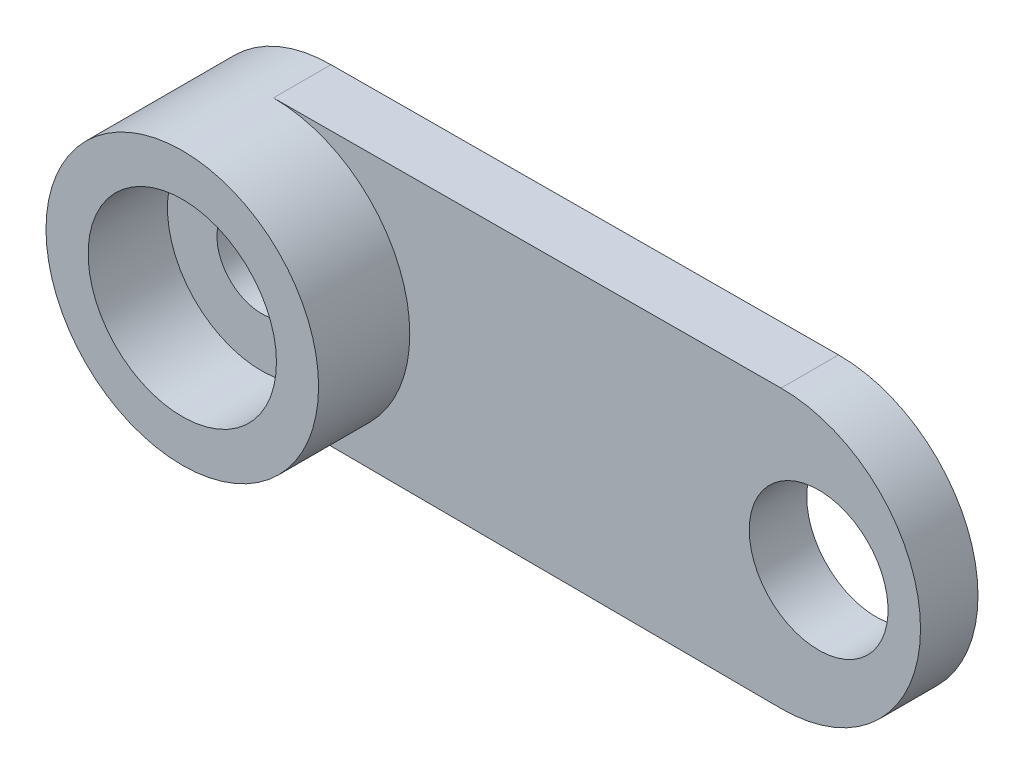
ISO-10303-21;
HEADER;
FILE_DESCRIPTION(('STEP AP214'),'2;1');
FILE_NAME('part.step','',(''),(''),'','','');
FILE_SCHEMA(('AUTOMOTIVE_DESIGN { 1 0 10303 214 1 1 1 1 }'));
ENDSEC;
DATA;
#1=APPLICATION_CONTEXT('core data for automotive mechanical design processes');
#2=APPLICATION_PROTOCOL_DEFINITION('international standard','automotive_design',2000,#1);
#3=PRODUCT_CONTEXT('',#1,'mechanical');
#4=PRODUCT('Part','Part','',(#3));
#5=PRODUCT_RELATED_PRODUCT_CATEGORY('part','',(#4));
#6=PRODUCT_DEFINITION_FORMATION('','',#4);
#7=PRODUCT_DEFINITION_CONTEXT('part definition',#1,'design');
#8=PRODUCT_DEFINITION('design','',#6,#7);
#9=PRODUCT_DEFINITION_SHAPE('','',#8);
#10=(LENGTH_UNIT() NAMED_UNIT(*) SI_UNIT(.MILLI.,.METRE.));
#11=(NAMED_UNIT(*) PLANE_ANGLE_UNIT() SI_UNIT($,.RADIAN.));
#12=(NAMED_UNIT(*) SI_UNIT($,.STERADIAN.) SOLID_ANGLE_UNIT());
#13=UNCERTAINTY_MEASURE_WITH_UNIT(LENGTH_MEASURE(1.E-05),#10,'distance_accuracy_value','');
#14=(GEOMETRIC_REPRESENTATION_CONTEXT(3) GLOBAL_UNCERTAINTY_ASSIGNED_CONTEXT((#13)) GLOBAL_UNIT_ASSIGNED_CONTEXT((#10,
#11,#12)) REPRESENTATION_CONTEXT('',''));
#15=CARTESIAN_POINT('',(0.,0.,0.));
#16=DIRECTION('',(0.,0.,1.));
#17=DIRECTION('',(1.,0.,0.));
#18=AXIS2_PLACEMENT_3D('',#15,#16,#17);
#19=CARTESIAN_POINT('',(0.,0.,-0.4445));
#20=DIRECTION('',(0.,0.,1.));
#21=DIRECTION('',(1.,0.,0.));
#22=AXIS2_PLACEMENT_3D('',#19,#20,#21);
#23=CYLINDRICAL_SURFACE('',#22,1.143);
#24=CARTESIAN_POINT('',(0.,0.,1.778));
#25=DIRECTION('',(0.,0.,1.));
#26=DIRECTION('',(1.,0.,0.));
#27=AXIS2_PLACEMENT_3D('',#24,#25,#26);
#28=CIRCLE('',#27,1.143);
#29=CARTESIAN_POINT('',(1.143,0.,1.778));
#30=VERTEX_POINT('',#29);
#31=EDGE_CURVE('E124',#30,#30,#28,.T.);
#32=ORIENTED_EDGE('',*,*,#31,.T.);
#33=EDGE_LOOP('',(#32));
#34=FACE_BOUND('',#33,.T.);
#35=CARTESIAN_POINT('',(0.,0.,1.016));
#36=DIRECTION('',(0.,0.,-1.));
#37=DIRECTION('',(-1.,0.,0.));
#38=AXIS2_PLACEMENT_3D('',#35,#36,#37);
#39=CIRCLE('',#38,1.143);
#40=CARTESIAN_POINT('',(-1.143,0.,1.016));
#41=VERTEX_POINT('',#40);
#42=EDGE_CURVE('E43',#41,#41,#39,.F.);
#43=ORIENTED_EDGE('',*,*,#42,.F.);
#44=EDGE_LOOP('',(#43));
#45=FACE_BOUND('',#44,.T.);
#46=ADVANCED_FACE('F39',(#34,#45),#23,.F.);
#47=CARTESIAN_POINT('',(0.,0.,3.81));
#48=DIRECTION('',(0.,0.,-1.));
#49=DIRECTION('',(-1.,0.,0.));
#50=AXIS2_PLACEMENT_3D('',#47,#48,#49);
#51=CYLINDRICAL_SURFACE('',#50,3.4925);
#52=CARTESIAN_POINT('',(0.,0.,0.));
#53=DIRECTION('',(0.,0.,1.));
#54=DIRECTION('',(1.,0.,0.));
#55=AXIS2_PLACEMENT_3D('',#52,#53,#54);
#56=CIRCLE('',#55,3.4925);
#57=CARTESIAN_POINT('',(0.,3.4925,0.));
#58=VERTEX_POINT('',#57);
#59=CARTESIAN_POINT('',(0.,-3.4925,0.));
#60=VERTEX_POINT('',#59);
#61=EDGE_CURVE('E48',#58,#60,#56,.T.);
#62=ORIENTED_EDGE('',*,*,#61,.T.);
#63=DIRECTION('',(0.,0.,-1.));
#64=VECTOR('',#63,1.);
#65=CARTESIAN_POINT('',(0.,-3.4925,1.4732));
#66=LINE('',#65,#64);
#67=CARTESIAN_POINT('',(0.,-3.4925,1.4732));
#68=VERTEX_POINT('',#67);
#69=EDGE_CURVE('E56',#68,#60,#66,.T.);
#70=ORIENTED_EDGE('',*,*,#69,.F.);
#71=CARTESIAN_POINT('',(0.,0.,1.4732));
#72=DIRECTION('',(0.,0.,1.));
#73=DIRECTION('',(-1.,0.,0.));
#74=AXIS2_PLACEMENT_3D('',#71,#72,#73);
#75=CIRCLE('',#74,3.4925);
#76=CARTESIAN_POINT('',(0.,3.4925,1.4732));
#77=VERTEX_POINT('',#76);
#78=EDGE_CURVE('E60',#68,#77,#75,.T.);
#79=ORIENTED_EDGE('',*,*,#78,.T.);
#80=DIRECTION('',(0.,0.,-1.));
#81=VECTOR('',#80,1.);
#82=CARTESIAN_POINT('',(0.,3.4925,1.4732));
#83=LINE('',#82,#81);
#84=EDGE_CURVE('E93',#77,#58,#83,.T.);
#85=ORIENTED_EDGE('',*,*,#84,.T.);
#86=EDGE_LOOP('',(#62,#70,#79,#85));
#87=FACE_BOUND('',#86,.T.);
#88=CARTESIAN_POINT('',(0.,0.,3.81));
#89=DIRECTION('',(0.,0.,1.));
#90=DIRECTION('',(1.,0.,0.));
#91=AXIS2_PLACEMENT_3D('',#88,#89,#90);
#92=CIRCLE('',#91,3.4925);
#93=CARTESIAN_POINT('',(3.4925,0.,3.81));
#94=VERTEX_POINT('',#93);
#95=EDGE_CURVE('E11',#94,#94,#92,.T.);
#96=ORIENTED_EDGE('',*,*,#95,.F.);
#97=EDGE_LOOP('',(#96));
#98=FACE_BOUND('',#97,.T.);
#99=ADVANCED_FACE('F41',(#87,#98),#51,.T.);
#100=CARTESIAN_POINT('',(0.,0.,3.81));
#101=DIRECTION('',(0.,0.,1.));
#102=DIRECTION('',(1.,0.,0.));
#103=AXIS2_PLACEMENT_3D('',#100,#101,#102);
#104=PLANE('',#103);
#105=CARTESIAN_POINT('',(0.,0.,3.81));
#106=DIRECTION('',(0.,0.,1.));
#107=DIRECTION('',(1.,0.,0.));
#108=AXIS2_PLACEMENT_3D('',#105,#106,#107);
#109=CIRCLE('',#108,2.413);
#110=CARTESIAN_POINT('',(2.413,0.,3.81));
#111=VERTEX_POINT('',#110);
#112=EDGE_CURVE('E127',#111,#111,#109,.T.);
#113=ORIENTED_EDGE('',*,*,#112,.F.);
#114=EDGE_LOOP('',(#113));
#115=FACE_BOUND('',#114,.T.);
#116=ORIENTED_EDGE('',*,*,#95,.T.);
#117=EDGE_LOOP('',(#116));
#118=FACE_BOUND('',#117,.T.);
#119=ADVANCED_FACE('F141',(#115,#118),#104,.T.);
#120=CARTESIAN_POINT('',(0.,0.,0.));
#121=DIRECTION('',(0.,0.,1.));
#122=DIRECTION('',(1.,0.,0.));
#123=AXIS2_PLACEMENT_3D('',#120,#121,#122);
#124=PLANE('',#123);
#125=CARTESIAN_POINT('',(0.,0.,0.));
#126=DIRECTION('',(0.,0.,-1.));
#127=DIRECTION('',(-1.,0.,0.));
#128=AXIS2_PLACEMENT_3D('',#125,#126,#127);
#129=CIRCLE('',#128,2.286);
#130=CARTESIAN_POINT('',(-2.286,0.,0.));
#131=VERTEX_POINT('',#130);
#132=EDGE_CURVE('E116',#131,#131,#129,.T.);
#133=ORIENTED_EDGE('',*,*,#132,.F.);
#134=EDGE_LOOP('',(#133));
#135=FACE_BOUND('',#134,.T.);
#136=ORIENTED_EDGE('',*,*,#61,.F.);
#137=DIRECTION('',(0.999988098878202,0.00487873979204865,0.));
#138=VECTOR('',#137,1.);
#139=CARTESIAN_POINT('',(0.,3.4925,0.));
#140=LINE('',#139,#138);
#141=CARTESIAN_POINT('',(13.0068269877265,3.55595767961089,0.));
#142=VERTEX_POINT('',#141);
#143=EDGE_CURVE('E109',#58,#142,#140,.T.);
#144=ORIENTED_EDGE('',*,*,#143,.T.);
#145=CARTESIAN_POINT('',(13.0241757864271,0.,0.));
#146=DIRECTION('',(0.,0.,-1.));
#147=DIRECTION('',(-1.,0.,0.));
#148=AXIS2_PLACEMENT_3D('',#145,#146,#147);
#149=CIRCLE('',#148,3.556);
#150=CARTESIAN_POINT('',(13.0068269877265,-3.55595767961089,0.));
#151=VERTEX_POINT('',#150);
#152=EDGE_CURVE('E87',#142,#151,#149,.T.);
#153=ORIENTED_EDGE('',*,*,#152,.T.);
#154=DIRECTION('',(-0.999988098878202,0.00487873979204865,0.));
#155=VECTOR('',#154,1.);
#156=CARTESIAN_POINT('',(13.0068269877265,-3.55595767961089,0.));
#157=LINE('',#156,#155);
#158=EDGE_CURVE('E104',#151,#60,#157,.T.);
#159=ORIENTED_EDGE('',*,*,#158,.T.);
#160=EDGE_LOOP('',(#136,#144,#153,#159));
#161=FACE_BOUND('',#160,.T.);
#162=CARTESIAN_POINT('',(13.97,0.,0.));
#163=DIRECTION('',(0.,0.,-1.));
#164=DIRECTION('',(-1.,0.,0.));
#165=AXIS2_PLACEMENT_3D('',#162,#163,#164);
#166=CIRCLE('',#165,1.778);
#167=CARTESIAN_POINT('',(12.192,0.,0.));
#168=VERTEX_POINT('',#167);
#169=EDGE_CURVE('E145',#168,#168,#166,.T.);
#170=ORIENTED_EDGE('',*,*,#169,.F.);
#171=EDGE_LOOP('',(#170));
#172=FACE_BOUND('',#171,.T.);
#173=ADVANCED_FACE('F137',(#135,#161,#172),#124,.F.);
#174=CARTESIAN_POINT('',(0.,0.,1.778));
#175=DIRECTION('',(0.,0.,1.));
#176=DIRECTION('',(1.,0.,0.));
#177=AXIS2_PLACEMENT_3D('',#174,#175,#176);
#178=CYLINDRICAL_SURFACE('',#177,2.413);
#179=CARTESIAN_POINT('',(0.,0.,1.778));
#180=DIRECTION('',(0.,0.,1.));
#181=DIRECTION('',(1.,0.,0.));
#182=AXIS2_PLACEMENT_3D('',#179,#180,#181);
#183=CIRCLE('',#182,2.413);
#184=CARTESIAN_POINT('',(2.413,0.,1.778));
#185=VERTEX_POINT('',#184);
#186=EDGE_CURVE('E128',#185,#185,#183,.T.);
#187=ORIENTED_EDGE('',*,*,#186,.F.);
#188=EDGE_LOOP('',(#187));
#189=FACE_BOUND('',#188,.T.);
#190=ORIENTED_EDGE('',*,*,#112,.T.);
#191=EDGE_LOOP('',(#190));
#192=FACE_BOUND('',#191,.T.);
#193=ADVANCED_FACE('F140',(#189,#192),#178,.F.);
#194=CARTESIAN_POINT('',(0.,0.,1.778));
#195=DIRECTION('',(0.,0.,1.));
#196=DIRECTION('',(1.,0.,0.));
#197=AXIS2_PLACEMENT_3D('',#194,#195,#196);
#198=PLANE('',#197);
#199=ORIENTED_EDGE('',*,*,#31,.F.);
#200=EDGE_LOOP('',(#199));
#201=FACE_BOUND('',#200,.T.);
#202=ORIENTED_EDGE('',*,*,#186,.T.);
#203=EDGE_LOOP('',(#202));
#204=FACE_BOUND('',#203,.T.);
#205=ADVANCED_FACE('F172',(#201,#204),#198,.T.);
#206=CARTESIAN_POINT('',(0.,0.,1.016));
#207=DIRECTION('',(0.,0.,-1.));
#208=DIRECTION('',(-1.,0.,0.));
#209=AXIS2_PLACEMENT_3D('',#206,#207,#208);
#210=PLANE('',#209);
#211=CARTESIAN_POINT('',(0.,0.,1.016));
#212=DIRECTION('',(0.,0.,-1.));
#213=DIRECTION('',(-1.,0.,0.));
#214=AXIS2_PLACEMENT_3D('',#211,#212,#213);
#215=CIRCLE('',#214,2.286);
#216=CARTESIAN_POINT('',(-2.286,0.,1.016));
#217=VERTEX_POINT('',#216);
#218=EDGE_CURVE('E119',#217,#217,#215,.T.);
#219=ORIENTED_EDGE('',*,*,#218,.T.);
#220=EDGE_LOOP('',(#219));
#221=FACE_BOUND('',#220,.T.);
#222=ORIENTED_EDGE('',*,*,#42,.T.);
#223=EDGE_LOOP('',(#222));
#224=FACE_BOUND('',#223,.T.);
#225=ADVANCED_FACE('F174',(#221,#224),#210,.T.);
#226=CARTESIAN_POINT('',(0.,0.,1.016));
#227=DIRECTION('',(0.,0.,-1.));
#228=DIRECTION('',(-1.,0.,0.));
#229=AXIS2_PLACEMENT_3D('',#226,#227,#228);
#230=CYLINDRICAL_SURFACE('',#229,2.286);
#231=ORIENTED_EDGE('',*,*,#218,.F.);
#232=EDGE_LOOP('',(#231));
#233=FACE_BOUND('',#232,.T.);
#234=ORIENTED_EDGE('',*,*,#132,.T.);
#235=EDGE_LOOP('',(#234));
#236=FACE_BOUND('',#235,.T.);
#237=ADVANCED_FACE('F170',(#233,#236),#230,.F.);
#238=CARTESIAN_POINT('',(13.0068269877265,-3.55595767961089,1.4732));
#239=DIRECTION('',(-0.00487873979204865,-0.999988098878202,0.));
#240=DIRECTION('',(0.999988098878202,-0.00487873979204865,0.));
#241=AXIS2_PLACEMENT_3D('',#238,#239,#240);
#242=PLANE('',#241);
#243=ORIENTED_EDGE('',*,*,#158,.F.);
#244=DIRECTION('',(0.,0.,-1.));
#245=VECTOR('',#244,1.);
#246=CARTESIAN_POINT('',(13.0068269877265,-3.55595767961089,1.4732));
#247=LINE('',#246,#245);
#248=CARTESIAN_POINT('',(13.0068269877265,-3.55595767961089,1.4732));
#249=VERTEX_POINT('',#248);
#250=EDGE_CURVE('E92',#249,#151,#247,.T.);
#251=ORIENTED_EDGE('',*,*,#250,.F.);
#252=DIRECTION('',(-0.999988098878202,0.00487873979204865,0.));
#253=VECTOR('',#252,1.);
#254=CARTESIAN_POINT('',(13.0068269877265,-3.55595767961089,1.4732));
#255=LINE('',#254,#253);
#256=EDGE_CURVE('E100',#249,#68,#255,.T.);
#257=ORIENTED_EDGE('',*,*,#256,.T.);
#258=ORIENTED_EDGE('',*,*,#69,.T.);
#259=EDGE_LOOP('',(#243,#251,#257,#258));
#260=FACE_BOUND('',#259,.T.);
#261=ADVANCED_FACE('F136',(#260),#242,.T.);
#262=CARTESIAN_POINT('',(13.0241757864271,0.,1.4732));
#263=DIRECTION('',(0.,0.,-1.));
#264=DIRECTION('',(-1.,0.,0.));
#265=AXIS2_PLACEMENT_3D('',#262,#263,#264);
#266=CYLINDRICAL_SURFACE('',#265,3.556);
#267=ORIENTED_EDGE('',*,*,#152,.F.);
#268=DIRECTION('',(0.,0.,-1.));
#269=VECTOR('',#268,1.);
#270=CARTESIAN_POINT('',(13.0068269877265,3.55595767961089,1.4732));
#271=LINE('',#270,#269);
#272=CARTESIAN_POINT('',(13.0068269877265,3.55595767961089,1.4732));
#273=VERTEX_POINT('',#272);
#274=EDGE_CURVE('E81',#273,#142,#271,.T.);
#275=ORIENTED_EDGE('',*,*,#274,.F.);
#276=CARTESIAN_POINT('',(13.0241757864271,0.,1.4732));
#277=DIRECTION('',(0.,0.,-1.));
#278=DIRECTION('',(-1.,0.,0.));
#279=AXIS2_PLACEMENT_3D('',#276,#277,#278);
#280=CIRCLE('',#279,3.556);
#281=EDGE_CURVE('E84',#273,#249,#280,.T.);
#282=ORIENTED_EDGE('',*,*,#281,.T.);
#283=ORIENTED_EDGE('',*,*,#250,.T.);
#284=EDGE_LOOP('',(#267,#275,#282,#283));
#285=FACE_BOUND('',#284,.T.);
#286=ADVANCED_FACE('F83',(#285),#266,.T.);
#287=CARTESIAN_POINT('',(0.,3.4925,1.4732));
#288=DIRECTION('',(-0.00487873979204865,0.999988098878202,0.));
#289=DIRECTION('',(-0.999988098878202,-0.00487873979204865,0.));
#290=AXIS2_PLACEMENT_3D('',#287,#288,#289);
#291=PLANE('',#290);
#292=ORIENTED_EDGE('',*,*,#143,.F.);
#293=ORIENTED_EDGE('',*,*,#84,.F.);
#294=DIRECTION('',(0.999988098878202,0.00487873979204865,0.));
#295=VECTOR('',#294,1.);
#296=CARTESIAN_POINT('',(0.,3.4925,1.4732));
#297=LINE('',#296,#295);
#298=EDGE_CURVE('E98',#77,#273,#297,.T.);
#299=ORIENTED_EDGE('',*,*,#298,.T.);
#300=ORIENTED_EDGE('',*,*,#274,.T.);
#301=EDGE_LOOP('',(#292,#293,#299,#300));
#302=FACE_BOUND('',#301,.T.);
#303=ADVANCED_FACE('F102',(#302),#291,.T.);
#304=CARTESIAN_POINT('',(0.,0.,1.4732));
#305=DIRECTION('',(0.,0.,-1.));
#306=DIRECTION('',(-1.,0.,0.));
#307=AXIS2_PLACEMENT_3D('',#304,#305,#306);
#308=PLANE('',#307);
#309=CARTESIAN_POINT('',(13.97,0.,1.4732));
#310=DIRECTION('',(0.,0.,-1.));
#311=DIRECTION('',(-1.,0.,0.));
#312=AXIS2_PLACEMENT_3D('',#309,#310,#311);
#313=CIRCLE('',#312,1.778);
#314=CARTESIAN_POINT('',(12.192,0.,1.4732));
#315=VERTEX_POINT('',#314);
#316=EDGE_CURVE('E111',#315,#315,#313,.T.);
#317=ORIENTED_EDGE('',*,*,#316,.T.);
#318=EDGE_LOOP('',(#317));
#319=FACE_BOUND('',#318,.T.);
#320=ORIENTED_EDGE('',*,*,#78,.F.);
#321=ORIENTED_EDGE('',*,*,#256,.F.);
#322=ORIENTED_EDGE('',*,*,#281,.F.);
#323=ORIENTED_EDGE('',*,*,#298,.F.);
#324=EDGE_LOOP('',(#320,#321,#322,#323));
#325=FACE_BOUND('',#324,.T.);
#326=ADVANCED_FACE('F97',(#319,#325),#308,.F.);
#327=CARTESIAN_POINT('',(13.97,0.,1.4732));
#328=DIRECTION('',(0.,0.,-1.));
#329=DIRECTION('',(-1.,0.,0.));
#330=AXIS2_PLACEMENT_3D('',#327,#328,#329);
#331=CYLINDRICAL_SURFACE('',#330,1.778);
#332=ORIENTED_EDGE('',*,*,#316,.F.);
#333=EDGE_LOOP('',(#332));
#334=FACE_BOUND('',#333,.T.);
#335=ORIENTED_EDGE('',*,*,#169,.T.);
#336=EDGE_LOOP('',(#335));
#337=FACE_BOUND('',#336,.T.);
#338=ADVANCED_FACE('F152',(#334,#337),#331,.F.);
#339=CLOSED_SHELL('',(#46,#99,#119,#173,#193,#205,#225,#237,#261,#286,#303,#326,#338));
#340=MANIFOLD_SOLID_BREP('B2',#339);
#341=ADVANCED_BREP_SHAPE_REPRESENTATION('',(#18,#340),#14);
#342=SHAPE_DEFINITION_REPRESENTATION(#9,#341);
ENDSEC;
END-ISO-10303-21;
